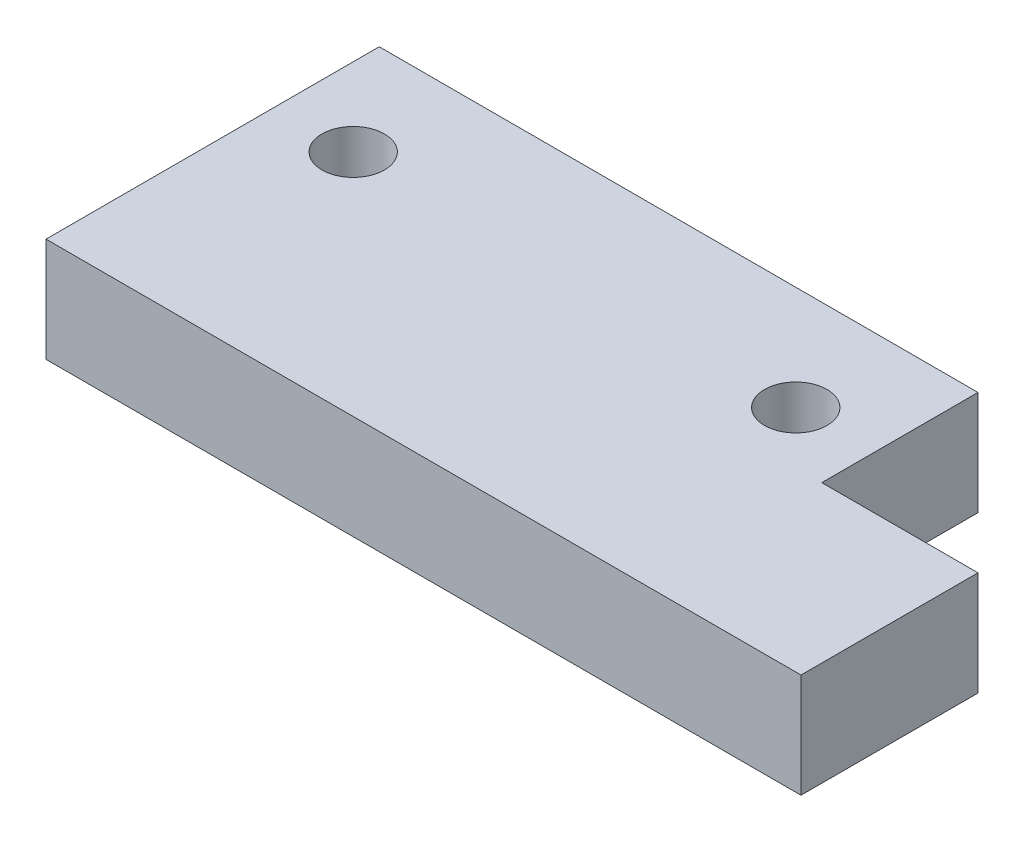
ISO-10303-21;
HEADER;
FILE_DESCRIPTION(('STEP AP214'),'2;1');
FILE_NAME('part.step','',(''),(''),'','','');
FILE_SCHEMA(('AUTOMOTIVE_DESIGN { 1 0 10303 214 1 1 1 1 }'));
ENDSEC;
DATA;
#1=APPLICATION_CONTEXT('core data for automotive mechanical design processes');
#2=APPLICATION_PROTOCOL_DEFINITION('international standard','automotive_design',2000,#1);
#3=PRODUCT_CONTEXT('',#1,'mechanical');
#4=PRODUCT('Part','Part','',(#3));
#5=PRODUCT_RELATED_PRODUCT_CATEGORY('part','',(#4));
#6=PRODUCT_DEFINITION_FORMATION('','',#4);
#7=PRODUCT_DEFINITION_CONTEXT('part definition',#1,'design');
#8=PRODUCT_DEFINITION('design','',#6,#7);
#9=PRODUCT_DEFINITION_SHAPE('','',#8);
#10=(LENGTH_UNIT() NAMED_UNIT(*) SI_UNIT(.MILLI.,.METRE.));
#11=(NAMED_UNIT(*) PLANE_ANGLE_UNIT() SI_UNIT($,.RADIAN.));
#12=(NAMED_UNIT(*) SI_UNIT($,.STERADIAN.) SOLID_ANGLE_UNIT());
#13=UNCERTAINTY_MEASURE_WITH_UNIT(LENGTH_MEASURE(1.E-05),#10,'distance_accuracy_value','');
#14=(GEOMETRIC_REPRESENTATION_CONTEXT(3) GLOBAL_UNCERTAINTY_ASSIGNED_CONTEXT((#13)) GLOBAL_UNIT_ASSIGNED_CONTEXT((#10,
#11,#12)) REPRESENTATION_CONTEXT('',''));
#15=CARTESIAN_POINT('',(0.,0.,0.));
#16=DIRECTION('',(0.,0.,1.));
#17=DIRECTION('',(1.,0.,0.));
#18=AXIS2_PLACEMENT_3D('',#15,#16,#17);
#19=CARTESIAN_POINT('',(35.,4.,0.));
#20=DIRECTION('',(-1.,0.,0.));
#21=DIRECTION('',(0.,0.,1.));
#22=AXIS2_PLACEMENT_3D('',#19,#20,#21);
#23=PLANE('',#22);
#24=DIRECTION('',(0.,0.,-1.));
#25=VECTOR('',#24,1.);
#26=CARTESIAN_POINT('',(35.,0.,0.));
#27=LINE('',#26,#25);
#28=CARTESIAN_POINT('',(35.,0.,-7.2));
#29=VERTEX_POINT('',#28);
#30=CARTESIAN_POINT('',(35.,0.,-14.));
#31=VERTEX_POINT('',#30);
#32=EDGE_CURVE('E153',#29,#31,#27,.T.);
#33=ORIENTED_EDGE('',*,*,#32,.F.);
#34=DIRECTION('',(0.,-1.,0.));
#35=VECTOR('',#34,1.);
#36=CARTESIAN_POINT('',(35.,5.,-7.2));
#37=LINE('',#36,#35);
#38=CARTESIAN_POINT('',(35.,-4.,-7.2));
#39=VERTEX_POINT('',#38);
#40=EDGE_CURVE('E55',#29,#39,#37,.T.);
#41=ORIENTED_EDGE('',*,*,#40,.T.);
#42=DIRECTION('',(0.,0.,-1.));
#43=VECTOR('',#42,1.);
#44=CARTESIAN_POINT('',(35.,-4.,0.));
#45=LINE('',#44,#43);
#46=CARTESIAN_POINT('',(35.,-4.,-14.));
#47=VERTEX_POINT('',#46);
#48=EDGE_CURVE('E111',#39,#47,#45,.T.);
#49=ORIENTED_EDGE('',*,*,#48,.T.);
#50=DIRECTION('',(0.,-1.,0.));
#51=VECTOR('',#50,1.);
#52=CARTESIAN_POINT('',(35.,5.,-14.));
#53=LINE('',#52,#51);
#54=EDGE_CURVE('E110',#31,#47,#53,.T.);
#55=ORIENTED_EDGE('',*,*,#54,.F.);
#56=EDGE_LOOP('',(#33,#41,#49,#55));
#57=FACE_BOUND('',#56,.T.);
#58=ADVANCED_FACE('F33',(#57),#23,.F.);
#59=CARTESIAN_POINT('',(0.,4.,-20.));
#60=DIRECTION('',(0.,0.,1.));
#61=DIRECTION('',(1.,0.,0.));
#62=AXIS2_PLACEMENT_3D('',#59,#60,#61);
#63=PLANE('',#62);
#64=DIRECTION('',(-1.,0.,0.));
#65=VECTOR('',#64,1.);
#66=CARTESIAN_POINT('',(0.,-4.,-20.));
#67=LINE('',#66,#65);
#68=CARTESIAN_POINT('',(29.,-4.,-20.));
#69=VERTEX_POINT('',#68);
#70=CARTESIAN_POINT('',(6.,-4.,-20.));
#71=VERTEX_POINT('',#70);
#72=EDGE_CURVE('E103',#69,#71,#67,.T.);
#73=ORIENTED_EDGE('',*,*,#72,.T.);
#74=DIRECTION('',(0.,1.,0.));
#75=VECTOR('',#74,1.);
#76=CARTESIAN_POINT('',(6.,-4.,-20.));
#77=LINE('',#76,#75);
#78=CARTESIAN_POINT('',(6.,0.,-20.));
#79=VERTEX_POINT('',#78);
#80=EDGE_CURVE('E85',#71,#79,#77,.T.);
#81=ORIENTED_EDGE('',*,*,#80,.T.);
#82=DIRECTION('',(-1.,0.,0.));
#83=VECTOR('',#82,1.);
#84=CARTESIAN_POINT('',(0.,0.,-20.));
#85=LINE('',#84,#83);
#86=CARTESIAN_POINT('',(29.,0.,-20.));
#87=VERTEX_POINT('',#86);
#88=EDGE_CURVE('E155',#87,#79,#85,.T.);
#89=ORIENTED_EDGE('',*,*,#88,.F.);
#90=DIRECTION('',(0.,1.,0.));
#91=VECTOR('',#90,1.);
#92=CARTESIAN_POINT('',(29.,4.,-20.));
#93=LINE('',#92,#91);
#94=EDGE_CURVE('E40',#69,#87,#93,.T.);
#95=ORIENTED_EDGE('',*,*,#94,.F.);
#96=EDGE_LOOP('',(#73,#81,#89,#95));
#97=FACE_BOUND('',#96,.T.);
#98=ADVANCED_FACE('F108',(#97),#63,.F.);
#99=CARTESIAN_POINT('',(6.,5.,-7.2));
#100=DIRECTION('',(0.,0.,1.));
#101=DIRECTION('',(1.,0.,0.));
#102=AXIS2_PLACEMENT_3D('',#99,#100,#101);
#103=PLANE('',#102);
#104=ORIENTED_EDGE('',*,*,#40,.F.);
#105=DIRECTION('',(-1.,0.,0.));
#106=VECTOR('',#105,1.);
#107=CARTESIAN_POINT('',(6.,0.,-7.2));
#108=LINE('',#107,#106);
#109=CARTESIAN_POINT('',(6.,0.,-7.2));
#110=VERTEX_POINT('',#109);
#111=EDGE_CURVE('E148',#29,#110,#108,.T.);
#112=ORIENTED_EDGE('',*,*,#111,.T.);
#113=DIRECTION('',(0.,-1.,0.));
#114=VECTOR('',#113,1.);
#115=CARTESIAN_POINT('',(6.,5.,-7.2));
#116=LINE('',#115,#114);
#117=CARTESIAN_POINT('',(6.,-4.,-7.2));
#118=VERTEX_POINT('',#117);
#119=EDGE_CURVE('E129',#110,#118,#116,.T.);
#120=ORIENTED_EDGE('',*,*,#119,.T.);
#121=DIRECTION('',(-1.,0.,0.));
#122=VECTOR('',#121,1.);
#123=CARTESIAN_POINT('',(0.,-4.,-7.2));
#124=LINE('',#123,#122);
#125=EDGE_CURVE('E106',#39,#118,#124,.T.);
#126=ORIENTED_EDGE('',*,*,#125,.F.);
#127=EDGE_LOOP('',(#104,#112,#120,#126));
#128=FACE_BOUND('',#127,.T.);
#129=ADVANCED_FACE('F191',(#128),#103,.T.);
#130=CARTESIAN_POINT('',(35.,5.,-14.));
#131=DIRECTION('',(0.,0.,-1.));
#132=DIRECTION('',(-1.,0.,0.));
#133=AXIS2_PLACEMENT_3D('',#130,#131,#132);
#134=PLANE('',#133);
#135=DIRECTION('',(0.,-1.,0.));
#136=VECTOR('',#135,1.);
#137=CARTESIAN_POINT('',(29.,5.,-14.));
#138=LINE('',#137,#136);
#139=CARTESIAN_POINT('',(29.,0.,-14.));
#140=VERTEX_POINT('',#139);
#141=CARTESIAN_POINT('',(29.,-4.,-14.));
#142=VERTEX_POINT('',#141);
#143=EDGE_CURVE('E113',#140,#142,#138,.T.);
#144=ORIENTED_EDGE('',*,*,#143,.F.);
#145=DIRECTION('',(1.,0.,0.));
#146=VECTOR('',#145,1.);
#147=CARTESIAN_POINT('',(35.,0.,-14.));
#148=LINE('',#147,#146);
#149=EDGE_CURVE('E47',#140,#31,#148,.T.);
#150=ORIENTED_EDGE('',*,*,#149,.T.);
#151=ORIENTED_EDGE('',*,*,#54,.T.);
#152=DIRECTION('',(1.,0.,0.));
#153=VECTOR('',#152,1.);
#154=CARTESIAN_POINT('',(0.,-4.,-14.));
#155=LINE('',#154,#153);
#156=EDGE_CURVE('E137',#142,#47,#155,.T.);
#157=ORIENTED_EDGE('',*,*,#156,.F.);
#158=EDGE_LOOP('',(#144,#150,#151,#157));
#159=FACE_BOUND('',#158,.T.);
#160=ADVANCED_FACE('F184',(#159),#134,.T.);
#161=CARTESIAN_POINT('',(29.,5.,-20.));
#162=DIRECTION('',(1.,0.,0.));
#163=DIRECTION('',(0.,0.,-1.));
#164=AXIS2_PLACEMENT_3D('',#161,#162,#163);
#165=PLANE('',#164);
#166=ORIENTED_EDGE('',*,*,#94,.T.);
#167=DIRECTION('',(0.,0.,1.));
#168=VECTOR('',#167,1.);
#169=CARTESIAN_POINT('',(29.,0.,-20.));
#170=LINE('',#169,#168);
#171=EDGE_CURVE('E133',#87,#140,#170,.T.);
#172=ORIENTED_EDGE('',*,*,#171,.T.);
#173=ORIENTED_EDGE('',*,*,#143,.T.);
#174=DIRECTION('',(0.,0.,1.));
#175=VECTOR('',#174,1.);
#176=CARTESIAN_POINT('',(29.,-4.,0.));
#177=LINE('',#176,#175);
#178=EDGE_CURVE('E121',#69,#142,#177,.T.);
#179=ORIENTED_EDGE('',*,*,#178,.F.);
#180=EDGE_LOOP('',(#166,#172,#173,#179));
#181=FACE_BOUND('',#180,.T.);
#182=ADVANCED_FACE('F132',(#181),#165,.T.);
#183=CARTESIAN_POINT('',(9.,4.,-16.));
#184=DIRECTION('',(0.,-1.,0.));
#185=DIRECTION('',(0.,0.,-1.));
#186=AXIS2_PLACEMENT_3D('',#183,#184,#185);
#187=CYLINDRICAL_SURFACE('',#186,1.2);
#188=CARTESIAN_POINT('',(9.,-2.,-16.));
#189=DIRECTION('',(0.,-1.,0.));
#190=DIRECTION('',(0.,0.,-1.));
#191=AXIS2_PLACEMENT_3D('',#188,#189,#190);
#192=CIRCLE('',#191,1.2);
#193=CARTESIAN_POINT('',(9.,-2.,-17.2));
#194=VERTEX_POINT('',#193);
#195=EDGE_CURVE('E118',#194,#194,#192,.T.);
#196=ORIENTED_EDGE('',*,*,#195,.T.);
#197=EDGE_LOOP('',(#196));
#198=FACE_BOUND('',#197,.T.);
#199=CARTESIAN_POINT('',(9.,0.,-16.));
#200=DIRECTION('',(0.,1.,0.));
#201=DIRECTION('',(0.,0.,1.));
#202=AXIS2_PLACEMENT_3D('',#199,#200,#201);
#203=CIRCLE('',#202,1.2);
#204=CARTESIAN_POINT('',(9.,0.,-14.8));
#205=VERTEX_POINT('',#204);
#206=EDGE_CURVE('E159',#205,#205,#203,.T.);
#207=ORIENTED_EDGE('',*,*,#206,.T.);
#208=EDGE_LOOP('',(#207));
#209=FACE_BOUND('',#208,.T.);
#210=ADVANCED_FACE('F174',(#198,#209),#187,.F.);
#211=CARTESIAN_POINT('',(26.,4.,-16.));
#212=DIRECTION('',(0.,-1.,0.));
#213=DIRECTION('',(0.,0.,-1.));
#214=AXIS2_PLACEMENT_3D('',#211,#212,#213);
#215=CYLINDRICAL_SURFACE('',#214,1.2);
#216=CARTESIAN_POINT('',(26.,-2.,-16.));
#217=DIRECTION('',(0.,-1.,0.));
#218=DIRECTION('',(0.,0.,-1.));
#219=AXIS2_PLACEMENT_3D('',#216,#217,#218);
#220=CIRCLE('',#219,1.2);
#221=CARTESIAN_POINT('',(26.,-2.,-17.2));
#222=VERTEX_POINT('',#221);
#223=EDGE_CURVE('E123',#222,#222,#220,.T.);
#224=ORIENTED_EDGE('',*,*,#223,.T.);
#225=EDGE_LOOP('',(#224));
#226=FACE_BOUND('',#225,.T.);
#227=CARTESIAN_POINT('',(26.,0.,-16.));
#228=DIRECTION('',(0.,1.,0.));
#229=DIRECTION('',(0.,0.,1.));
#230=AXIS2_PLACEMENT_3D('',#227,#228,#229);
#231=CIRCLE('',#230,1.2);
#232=CARTESIAN_POINT('',(26.,0.,-14.8));
#233=VERTEX_POINT('',#232);
#234=EDGE_CURVE('E95',#233,#233,#231,.T.);
#235=ORIENTED_EDGE('',*,*,#234,.T.);
#236=EDGE_LOOP('',(#235));
#237=FACE_BOUND('',#236,.T.);
#238=ADVANCED_FACE('F165',(#226,#237),#215,.F.);
#239=CARTESIAN_POINT('',(0.,-4.,0.));
#240=DIRECTION('',(0.,1.,0.));
#241=DIRECTION('',(0.,0.,-1.));
#242=AXIS2_PLACEMENT_3D('',#239,#240,#241);
#243=PLANE('',#242);
#244=CARTESIAN_POINT('',(9.,-4.,-16.));
#245=DIRECTION('',(0.,-1.,0.));
#246=DIRECTION('',(0.,0.,-1.));
#247=AXIS2_PLACEMENT_3D('',#244,#245,#246);
#248=CIRCLE('',#247,2.2);
#249=CARTESIAN_POINT('',(9.,-4.,-18.2));
#250=VERTEX_POINT('',#249);
#251=EDGE_CURVE('E125',#250,#250,#248,.T.);
#252=ORIENTED_EDGE('',*,*,#251,.F.);
#253=EDGE_LOOP('',(#252));
#254=FACE_BOUND('',#253,.T.);
#255=ORIENTED_EDGE('',*,*,#125,.T.);
#256=DIRECTION('',(0.,0.,-1.));
#257=VECTOR('',#256,1.);
#258=CARTESIAN_POINT('',(6.,-4.,0.));
#259=LINE('',#258,#257);
#260=EDGE_CURVE('E88',#118,#71,#259,.T.);
#261=ORIENTED_EDGE('',*,*,#260,.T.);
#262=ORIENTED_EDGE('',*,*,#72,.F.);
#263=ORIENTED_EDGE('',*,*,#178,.T.);
#264=ORIENTED_EDGE('',*,*,#156,.T.);
#265=ORIENTED_EDGE('',*,*,#48,.F.);
#266=EDGE_LOOP('',(#255,#261,#262,#263,#264,#265));
#267=FACE_BOUND('',#266,.T.);
#268=CARTESIAN_POINT('',(26.,-4.,-16.));
#269=DIRECTION('',(0.,-1.,0.));
#270=DIRECTION('',(0.,0.,-1.));
#271=AXIS2_PLACEMENT_3D('',#268,#269,#270);
#272=CIRCLE('',#271,2.2);
#273=CARTESIAN_POINT('',(26.,-4.,-18.2));
#274=VERTEX_POINT('',#273);
#275=EDGE_CURVE('E145',#274,#274,#272,.T.);
#276=ORIENTED_EDGE('',*,*,#275,.F.);
#277=EDGE_LOOP('',(#276));
#278=FACE_BOUND('',#277,.T.);
#279=ADVANCED_FACE('F100',(#254,#267,#278),#243,.F.);
#280=CARTESIAN_POINT('',(9.,-2.,-16.));
#281=DIRECTION('',(0.,-1.,0.));
#282=DIRECTION('',(0.,0.,1.));
#283=AXIS2_PLACEMENT_3D('',#280,#281,#282);
#284=CYLINDRICAL_SURFACE('',#283,2.2);
#285=CARTESIAN_POINT('',(9.,-2.,-16.));
#286=DIRECTION('',(0.,-1.,0.));
#287=DIRECTION('',(0.,0.,-1.));
#288=AXIS2_PLACEMENT_3D('',#285,#286,#287);
#289=CIRCLE('',#288,2.2);
#290=CARTESIAN_POINT('',(9.,-2.,-18.2));
#291=VERTEX_POINT('',#290);
#292=EDGE_CURVE('E122',#291,#291,#289,.T.);
#293=ORIENTED_EDGE('',*,*,#292,.F.);
#294=EDGE_LOOP('',(#293));
#295=FACE_BOUND('',#294,.T.);
#296=ORIENTED_EDGE('',*,*,#251,.T.);
#297=EDGE_LOOP('',(#296));
#298=FACE_BOUND('',#297,.T.);
#299=ADVANCED_FACE('F262',(#295,#298),#284,.F.);
#300=CARTESIAN_POINT('',(9.,-2.,-16.));
#301=DIRECTION('',(0.,1.,0.));
#302=DIRECTION('',(0.,0.,-1.));
#303=AXIS2_PLACEMENT_3D('',#300,#301,#302);
#304=PLANE('',#303);
#305=ORIENTED_EDGE('',*,*,#195,.F.);
#306=EDGE_LOOP('',(#305));
#307=FACE_BOUND('',#306,.T.);
#308=ORIENTED_EDGE('',*,*,#292,.T.);
#309=EDGE_LOOP('',(#308));
#310=FACE_BOUND('',#309,.T.);
#311=ADVANCED_FACE('F252',(#307,#310),#304,.F.);
#312=CARTESIAN_POINT('',(26.,-2.,-16.));
#313=DIRECTION('',(0.,-1.,0.));
#314=DIRECTION('',(0.,0.,1.));
#315=AXIS2_PLACEMENT_3D('',#312,#313,#314);
#316=CYLINDRICAL_SURFACE('',#315,2.2);
#317=CARTESIAN_POINT('',(26.,-2.,-16.));
#318=DIRECTION('',(0.,-1.,0.));
#319=DIRECTION('',(0.,0.,-1.));
#320=AXIS2_PLACEMENT_3D('',#317,#318,#319);
#321=CIRCLE('',#320,2.2);
#322=CARTESIAN_POINT('',(26.,-2.,-18.2));
#323=VERTEX_POINT('',#322);
#324=EDGE_CURVE('E126',#323,#323,#321,.T.);
#325=ORIENTED_EDGE('',*,*,#324,.F.);
#326=EDGE_LOOP('',(#325));
#327=FACE_BOUND('',#326,.T.);
#328=ORIENTED_EDGE('',*,*,#275,.T.);
#329=EDGE_LOOP('',(#328));
#330=FACE_BOUND('',#329,.T.);
#331=ADVANCED_FACE('F242',(#327,#330),#316,.F.);
#332=CARTESIAN_POINT('',(26.,-2.,-16.));
#333=DIRECTION('',(0.,1.,0.));
#334=DIRECTION('',(0.,0.,-1.));
#335=AXIS2_PLACEMENT_3D('',#332,#333,#334);
#336=PLANE('',#335);
#337=ORIENTED_EDGE('',*,*,#223,.F.);
#338=EDGE_LOOP('',(#337));
#339=FACE_BOUND('',#338,.T.);
#340=ORIENTED_EDGE('',*,*,#324,.T.);
#341=EDGE_LOOP('',(#340));
#342=FACE_BOUND('',#341,.T.);
#343=ADVANCED_FACE('F170',(#339,#342),#336,.F.);
#344=CARTESIAN_POINT('',(0.,0.,0.));
#345=DIRECTION('',(0.,1.,0.));
#346=DIRECTION('',(0.,0.,1.));
#347=AXIS2_PLACEMENT_3D('',#344,#345,#346);
#348=PLANE('',#347);
#349=DIRECTION('',(0.,0.,-1.));
#350=VECTOR('',#349,1.);
#351=CARTESIAN_POINT('',(6.,0.,0.));
#352=LINE('',#351,#350);
#353=EDGE_CURVE('E11',#110,#79,#352,.T.);
#354=ORIENTED_EDGE('',*,*,#353,.F.);
#355=ORIENTED_EDGE('',*,*,#111,.F.);
#356=ORIENTED_EDGE('',*,*,#32,.T.);
#357=ORIENTED_EDGE('',*,*,#149,.F.);
#358=ORIENTED_EDGE('',*,*,#171,.F.);
#359=ORIENTED_EDGE('',*,*,#88,.T.);
#360=EDGE_LOOP('',(#354,#355,#356,#357,#358,#359));
#361=FACE_BOUND('',#360,.T.);
#362=ORIENTED_EDGE('',*,*,#234,.F.);
#363=EDGE_LOOP('',(#362));
#364=FACE_BOUND('',#363,.T.);
#365=ORIENTED_EDGE('',*,*,#206,.F.);
#366=EDGE_LOOP('',(#365));
#367=FACE_BOUND('',#366,.T.);
#368=ADVANCED_FACE('F167',(#361,#364,#367),#348,.T.);
#369=CARTESIAN_POINT('',(6.,-4.,0.));
#370=DIRECTION('',(1.,0.,0.));
#371=DIRECTION('',(0.,0.,-1.));
#372=AXIS2_PLACEMENT_3D('',#369,#370,#371);
#373=PLANE('',#372);
#374=ORIENTED_EDGE('',*,*,#119,.F.);
#375=ORIENTED_EDGE('',*,*,#353,.T.);
#376=ORIENTED_EDGE('',*,*,#80,.F.);
#377=ORIENTED_EDGE('',*,*,#260,.F.);
#378=EDGE_LOOP('',(#374,#375,#376,#377));
#379=FACE_BOUND('',#378,.T.);
#380=ADVANCED_FACE('F87',(#379),#373,.F.);
#381=CLOSED_SHELL('',(#58,#98,#129,#160,#182,#210,#238,#279,#299,#311,#331,#343,#368,#380));
#382=MANIFOLD_SOLID_BREP('B2',#381);
#383=ADVANCED_BREP_SHAPE_REPRESENTATION('',(#18,#382),#14);
#384=SHAPE_DEFINITION_REPRESENTATION(#9,#383);
ENDSEC;
END-ISO-10303-21;
